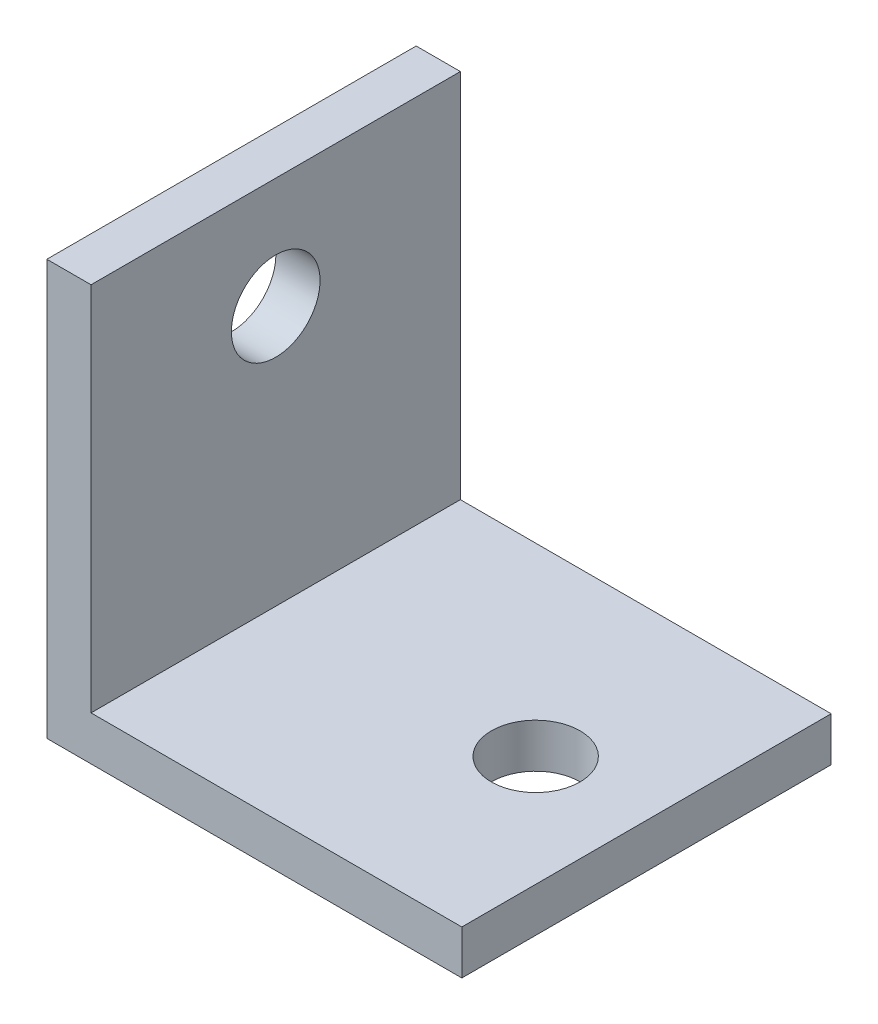
ISO-10303-21;
HEADER;
FILE_DESCRIPTION(('STEP AP214'),'2;1');
FILE_NAME('part.step','',(''),(''),'','','');
FILE_SCHEMA(('AUTOMOTIVE_DESIGN { 1 0 10303 214 1 1 1 1 }'));
ENDSEC;
DATA;
#1=APPLICATION_CONTEXT('core data for automotive mechanical design processes');
#2=APPLICATION_PROTOCOL_DEFINITION('international standard','automotive_design',2000,#1);
#3=PRODUCT_CONTEXT('',#1,'mechanical');
#4=PRODUCT('Part','Part','',(#3));
#5=PRODUCT_RELATED_PRODUCT_CATEGORY('part','',(#4));
#6=PRODUCT_DEFINITION_FORMATION('','',#4);
#7=PRODUCT_DEFINITION_CONTEXT('part definition',#1,'design');
#8=PRODUCT_DEFINITION('design','',#6,#7);
#9=PRODUCT_DEFINITION_SHAPE('','',#8);
#10=(LENGTH_UNIT() NAMED_UNIT(*) SI_UNIT(.MILLI.,.METRE.));
#11=(NAMED_UNIT(*) PLANE_ANGLE_UNIT() SI_UNIT($,.RADIAN.));
#12=(NAMED_UNIT(*) SI_UNIT($,.STERADIAN.) SOLID_ANGLE_UNIT());
#13=UNCERTAINTY_MEASURE_WITH_UNIT(LENGTH_MEASURE(1.E-05),#10,'distance_accuracy_value','');
#14=(GEOMETRIC_REPRESENTATION_CONTEXT(3) GLOBAL_UNCERTAINTY_ASSIGNED_CONTEXT((#13)) GLOBAL_UNIT_ASSIGNED_CONTEXT((#10,
#11,#12)) REPRESENTATION_CONTEXT('',''));
#15=CARTESIAN_POINT('',(0.,0.,0.));
#16=DIRECTION('',(0.,0.,1.));
#17=DIRECTION('',(1.,0.,0.));
#18=AXIS2_PLACEMENT_3D('',#15,#16,#17);
#19=CARTESIAN_POINT('',(0.,14.27,12.7));
#20=DIRECTION('',(1.,0.,0.));
#21=DIRECTION('',(0.,1.,0.));
#22=AXIS2_PLACEMENT_3D('',#19,#20,#21);
#23=PLANE('',#22);
#24=CARTESIAN_POINT('',(0.,10.46,6.35));
#25=DIRECTION('',(1.,0.,0.));
#26=DIRECTION('',(0.,1.,0.));
#27=AXIS2_PLACEMENT_3D('',#24,#25,#26);
#28=CIRCLE('',#27,1.525);
#29=CARTESIAN_POINT('',(0.,11.985,6.35));
#30=VERTEX_POINT('',#29);
#31=EDGE_CURVE('E121',#30,#30,#28,.T.);
#32=ORIENTED_EDGE('',*,*,#31,.T.);
#33=EDGE_LOOP('',(#32));
#34=FACE_BOUND('',#33,.T.);
#35=DIRECTION('',(0.,-1.,0.));
#36=VECTOR('',#35,1.);
#37=CARTESIAN_POINT('',(0.,14.27,0.));
#38=LINE('',#37,#36);
#39=CARTESIAN_POINT('',(0.,14.27,0.));
#40=VERTEX_POINT('',#39);
#41=CARTESIAN_POINT('',(0.,0.,0.));
#42=VERTEX_POINT('',#41);
#43=EDGE_CURVE('E117',#40,#42,#38,.T.);
#44=ORIENTED_EDGE('',*,*,#43,.T.);
#45=DIRECTION('',(0.,0.,-1.));
#46=VECTOR('',#45,1.);
#47=CARTESIAN_POINT('',(0.,0.,12.7));
#48=LINE('',#47,#46);
#49=CARTESIAN_POINT('',(0.,0.,12.7));
#50=VERTEX_POINT('',#49);
#51=EDGE_CURVE('E11',#50,#42,#48,.T.);
#52=ORIENTED_EDGE('',*,*,#51,.F.);
#53=DIRECTION('',(0.,-1.,0.));
#54=VECTOR('',#53,1.);
#55=CARTESIAN_POINT('',(0.,14.27,12.7));
#56=LINE('',#55,#54);
#57=CARTESIAN_POINT('',(0.,14.27,12.7));
#58=VERTEX_POINT('',#57);
#59=EDGE_CURVE('E128',#58,#50,#56,.T.);
#60=ORIENTED_EDGE('',*,*,#59,.F.);
#61=DIRECTION('',(0.,0.,-1.));
#62=VECTOR('',#61,1.);
#63=CARTESIAN_POINT('',(0.,14.27,12.7));
#64=LINE('',#63,#62);
#65=EDGE_CURVE('E113',#58,#40,#64,.T.);
#66=ORIENTED_EDGE('',*,*,#65,.T.);
#67=EDGE_LOOP('',(#44,#52,#60,#66));
#68=FACE_BOUND('',#67,.T.);
#69=ADVANCED_FACE('F33',(#34,#68),#23,.F.);
#70=CARTESIAN_POINT('',(0.,0.,12.7));
#71=DIRECTION('',(0.,1.,0.));
#72=DIRECTION('',(0.,0.,1.));
#73=AXIS2_PLACEMENT_3D('',#70,#71,#72);
#74=PLANE('',#73);
#75=CARTESIAN_POINT('',(10.46,0.,6.35));
#76=DIRECTION('',(0.,1.,0.));
#77=DIRECTION('',(0.,0.,1.));
#78=AXIS2_PLACEMENT_3D('',#75,#76,#77);
#79=CIRCLE('',#78,1.525);
#80=CARTESIAN_POINT('',(10.46,0.,7.875));
#81=VERTEX_POINT('',#80);
#82=EDGE_CURVE('E165',#81,#81,#79,.T.);
#83=ORIENTED_EDGE('',*,*,#82,.T.);
#84=EDGE_LOOP('',(#83));
#85=FACE_BOUND('',#84,.T.);
#86=DIRECTION('',(1.,0.,0.));
#87=VECTOR('',#86,1.);
#88=CARTESIAN_POINT('',(0.,0.,0.));
#89=LINE('',#88,#87);
#90=CARTESIAN_POINT('',(14.27,0.,0.));
#91=VERTEX_POINT('',#90);
#92=EDGE_CURVE('E120',#42,#91,#89,.T.);
#93=ORIENTED_EDGE('',*,*,#92,.T.);
#94=DIRECTION('',(0.,0.,-1.));
#95=VECTOR('',#94,1.);
#96=CARTESIAN_POINT('',(14.27,0.,12.7));
#97=LINE('',#96,#95);
#98=CARTESIAN_POINT('',(14.27,0.,12.7));
#99=VERTEX_POINT('',#98);
#100=EDGE_CURVE('E41',#99,#91,#97,.T.);
#101=ORIENTED_EDGE('',*,*,#100,.F.);
#102=DIRECTION('',(1.,0.,0.));
#103=VECTOR('',#102,1.);
#104=CARTESIAN_POINT('',(0.,0.,12.7));
#105=LINE('',#104,#103);
#106=EDGE_CURVE('E86',#50,#99,#105,.T.);
#107=ORIENTED_EDGE('',*,*,#106,.F.);
#108=ORIENTED_EDGE('',*,*,#51,.T.);
#109=EDGE_LOOP('',(#93,#101,#107,#108));
#110=FACE_BOUND('',#109,.T.);
#111=ADVANCED_FACE('F153',(#85,#110),#74,.F.);
#112=CARTESIAN_POINT('',(14.27,0.,12.7));
#113=DIRECTION('',(-1.,0.,0.));
#114=DIRECTION('',(0.,0.,1.));
#115=AXIS2_PLACEMENT_3D('',#112,#113,#114);
#116=PLANE('',#115);
#117=DIRECTION('',(0.,1.,0.));
#118=VECTOR('',#117,1.);
#119=CARTESIAN_POINT('',(14.27,0.,0.));
#120=LINE('',#119,#118);
#121=CARTESIAN_POINT('',(14.27,1.52,0.));
#122=VERTEX_POINT('',#121);
#123=EDGE_CURVE('E123',#91,#122,#120,.T.);
#124=ORIENTED_EDGE('',*,*,#123,.T.);
#125=DIRECTION('',(0.,0.,-1.));
#126=VECTOR('',#125,1.);
#127=CARTESIAN_POINT('',(14.27,1.52,12.7));
#128=LINE('',#127,#126);
#129=CARTESIAN_POINT('',(14.27,1.52,12.7));
#130=VERTEX_POINT('',#129);
#131=EDGE_CURVE('E108',#130,#122,#128,.T.);
#132=ORIENTED_EDGE('',*,*,#131,.F.);
#133=DIRECTION('',(0.,1.,0.));
#134=VECTOR('',#133,1.);
#135=CARTESIAN_POINT('',(14.27,0.,12.7));
#136=LINE('',#135,#134);
#137=EDGE_CURVE('E99',#99,#130,#136,.T.);
#138=ORIENTED_EDGE('',*,*,#137,.F.);
#139=ORIENTED_EDGE('',*,*,#100,.T.);
#140=EDGE_LOOP('',(#124,#132,#138,#139));
#141=FACE_BOUND('',#140,.T.);
#142=ADVANCED_FACE('F134',(#141),#116,.F.);
#143=CARTESIAN_POINT('',(14.27,1.52,12.7));
#144=DIRECTION('',(0.,-1.,0.));
#145=DIRECTION('',(1.,0.,0.));
#146=AXIS2_PLACEMENT_3D('',#143,#144,#145);
#147=PLANE('',#146);
#148=CARTESIAN_POINT('',(10.46,1.52,6.35));
#149=DIRECTION('',(0.,1.,0.));
#150=DIRECTION('',(-1.,0.,0.));
#151=AXIS2_PLACEMENT_3D('',#148,#149,#150);
#152=CIRCLE('',#151,1.525);
#153=CARTESIAN_POINT('',(8.935,1.52,6.35));
#154=VERTEX_POINT('',#153);
#155=EDGE_CURVE('E172',#154,#154,#152,.T.);
#156=ORIENTED_EDGE('',*,*,#155,.F.);
#157=EDGE_LOOP('',(#156));
#158=FACE_BOUND('',#157,.T.);
#159=DIRECTION('',(-1.,0.,0.));
#160=VECTOR('',#159,1.);
#161=CARTESIAN_POINT('',(14.27,1.52,0.));
#162=LINE('',#161,#160);
#163=CARTESIAN_POINT('',(1.52,1.52,0.));
#164=VERTEX_POINT('',#163);
#165=EDGE_CURVE('E107',#122,#164,#162,.T.);
#166=ORIENTED_EDGE('',*,*,#165,.T.);
#167=DIRECTION('',(0.,0.,-1.));
#168=VECTOR('',#167,1.);
#169=CARTESIAN_POINT('',(1.52,1.52,12.7));
#170=LINE('',#169,#168);
#171=CARTESIAN_POINT('',(1.52,1.52,12.7));
#172=VERTEX_POINT('',#171);
#173=EDGE_CURVE('E104',#172,#164,#170,.T.);
#174=ORIENTED_EDGE('',*,*,#173,.F.);
#175=DIRECTION('',(-1.,0.,0.));
#176=VECTOR('',#175,1.);
#177=CARTESIAN_POINT('',(14.27,1.52,12.7));
#178=LINE('',#177,#176);
#179=EDGE_CURVE('E93',#130,#172,#178,.T.);
#180=ORIENTED_EDGE('',*,*,#179,.F.);
#181=ORIENTED_EDGE('',*,*,#131,.T.);
#182=EDGE_LOOP('',(#166,#174,#180,#181));
#183=FACE_BOUND('',#182,.T.);
#184=ADVANCED_FACE('F105',(#158,#183),#147,.F.);
#185=CARTESIAN_POINT('',(1.52,1.52,12.7));
#186=DIRECTION('',(-1.,0.,0.));
#187=DIRECTION('',(0.,-1.,0.));
#188=AXIS2_PLACEMENT_3D('',#185,#186,#187);
#189=PLANE('',#188);
#190=CARTESIAN_POINT('',(1.52,10.46,6.35));
#191=DIRECTION('',(1.,0.,0.));
#192=DIRECTION('',(0.,1.,0.));
#193=AXIS2_PLACEMENT_3D('',#190,#191,#192);
#194=CIRCLE('',#193,1.525);
#195=CARTESIAN_POINT('',(1.52,11.985,6.35));
#196=VERTEX_POINT('',#195);
#197=EDGE_CURVE('E162',#196,#196,#194,.T.);
#198=ORIENTED_EDGE('',*,*,#197,.F.);
#199=EDGE_LOOP('',(#198));
#200=FACE_BOUND('',#199,.T.);
#201=DIRECTION('',(0.,1.,0.));
#202=VECTOR('',#201,1.);
#203=CARTESIAN_POINT('',(1.52,1.52,0.));
#204=LINE('',#203,#202);
#205=CARTESIAN_POINT('',(1.52,14.27,0.));
#206=VERTEX_POINT('',#205);
#207=EDGE_CURVE('E72',#164,#206,#204,.T.);
#208=ORIENTED_EDGE('',*,*,#207,.T.);
#209=DIRECTION('',(0.,0.,-1.));
#210=VECTOR('',#209,1.);
#211=CARTESIAN_POINT('',(1.52,14.27,12.7));
#212=LINE('',#211,#210);
#213=CARTESIAN_POINT('',(1.52,14.27,12.7));
#214=VERTEX_POINT('',#213);
#215=EDGE_CURVE('E109',#214,#206,#212,.T.);
#216=ORIENTED_EDGE('',*,*,#215,.F.);
#217=DIRECTION('',(0.,1.,0.));
#218=VECTOR('',#217,1.);
#219=CARTESIAN_POINT('',(1.52,1.52,12.7));
#220=LINE('',#219,#218);
#221=EDGE_CURVE('E97',#172,#214,#220,.T.);
#222=ORIENTED_EDGE('',*,*,#221,.F.);
#223=ORIENTED_EDGE('',*,*,#173,.T.);
#224=EDGE_LOOP('',(#208,#216,#222,#223));
#225=FACE_BOUND('',#224,.T.);
#226=ADVANCED_FACE('F111',(#200,#225),#189,.F.);
#227=CARTESIAN_POINT('',(1.52,14.27,12.7));
#228=DIRECTION('',(0.,-1.,0.));
#229=DIRECTION('',(0.,0.,-1.));
#230=AXIS2_PLACEMENT_3D('',#227,#228,#229);
#231=PLANE('',#230);
#232=DIRECTION('',(-1.,0.,0.));
#233=VECTOR('',#232,1.);
#234=CARTESIAN_POINT('',(1.52,14.27,0.));
#235=LINE('',#234,#233);
#236=EDGE_CURVE('E78',#206,#40,#235,.T.);
#237=ORIENTED_EDGE('',*,*,#236,.T.);
#238=ORIENTED_EDGE('',*,*,#65,.F.);
#239=DIRECTION('',(-1.,0.,0.));
#240=VECTOR('',#239,1.);
#241=CARTESIAN_POINT('',(1.52,14.27,12.7));
#242=LINE('',#241,#240);
#243=EDGE_CURVE('E49',#214,#58,#242,.T.);
#244=ORIENTED_EDGE('',*,*,#243,.F.);
#245=ORIENTED_EDGE('',*,*,#215,.T.);
#246=EDGE_LOOP('',(#237,#238,#244,#245));
#247=FACE_BOUND('',#246,.T.);
#248=ADVANCED_FACE('F141',(#247),#231,.F.);
#249=CARTESIAN_POINT('',(0.,0.,12.7));
#250=DIRECTION('',(0.,0.,1.));
#251=DIRECTION('',(1.,0.,0.));
#252=AXIS2_PLACEMENT_3D('',#249,#250,#251);
#253=PLANE('',#252);
#254=ORIENTED_EDGE('',*,*,#59,.T.);
#255=ORIENTED_EDGE('',*,*,#106,.T.);
#256=ORIENTED_EDGE('',*,*,#137,.T.);
#257=ORIENTED_EDGE('',*,*,#179,.T.);
#258=ORIENTED_EDGE('',*,*,#221,.T.);
#259=ORIENTED_EDGE('',*,*,#243,.T.);
#260=EDGE_LOOP('',(#254,#255,#256,#257,#258,#259));
#261=FACE_BOUND('',#260,.T.);
#262=ADVANCED_FACE('F95',(#261),#253,.T.);
#263=CARTESIAN_POINT('',(0.,0.,0.));
#264=DIRECTION('',(0.,0.,1.));
#265=DIRECTION('',(1.,0.,0.));
#266=AXIS2_PLACEMENT_3D('',#263,#264,#265);
#267=PLANE('',#266);
#268=ORIENTED_EDGE('',*,*,#43,.F.);
#269=ORIENTED_EDGE('',*,*,#236,.F.);
#270=ORIENTED_EDGE('',*,*,#207,.F.);
#271=ORIENTED_EDGE('',*,*,#165,.F.);
#272=ORIENTED_EDGE('',*,*,#123,.F.);
#273=ORIENTED_EDGE('',*,*,#92,.F.);
#274=EDGE_LOOP('',(#268,#269,#270,#271,#272,#273));
#275=FACE_BOUND('',#274,.T.);
#276=ADVANCED_FACE('F137',(#275),#267,.F.);
#277=CARTESIAN_POINT('',(-11.18,10.46,6.35));
#278=DIRECTION('',(1.,0.,0.));
#279=DIRECTION('',(0.,1.,0.));
#280=AXIS2_PLACEMENT_3D('',#277,#278,#279);
#281=CYLINDRICAL_SURFACE('',#280,1.525);
#282=ORIENTED_EDGE('',*,*,#197,.T.);
#283=EDGE_LOOP('',(#282));
#284=FACE_BOUND('',#283,.T.);
#285=ORIENTED_EDGE('',*,*,#31,.F.);
#286=EDGE_LOOP('',(#285));
#287=FACE_BOUND('',#286,.T.);
#288=ADVANCED_FACE('F197',(#284,#287),#281,.F.);
#289=CARTESIAN_POINT('',(10.46,-11.18,6.35));
#290=DIRECTION('',(0.,1.,0.));
#291=DIRECTION('',(-1.,0.,0.));
#292=AXIS2_PLACEMENT_3D('',#289,#290,#291);
#293=CYLINDRICAL_SURFACE('',#292,1.525);
#294=ORIENTED_EDGE('',*,*,#155,.T.);
#295=EDGE_LOOP('',(#294));
#296=FACE_BOUND('',#295,.T.);
#297=ORIENTED_EDGE('',*,*,#82,.F.);
#298=EDGE_LOOP('',(#297));
#299=FACE_BOUND('',#298,.T.);
#300=ADVANCED_FACE('F176',(#296,#299),#293,.F.);
#301=CLOSED_SHELL('',(#69,#111,#142,#184,#226,#248,#262,#276,#288,#300));
#302=MANIFOLD_SOLID_BREP('B2',#301);
#303=ADVANCED_BREP_SHAPE_REPRESENTATION('',(#18,#302),#14);
#304=SHAPE_DEFINITION_REPRESENTATION(#9,#303);
ENDSEC;
END-ISO-10303-21;
